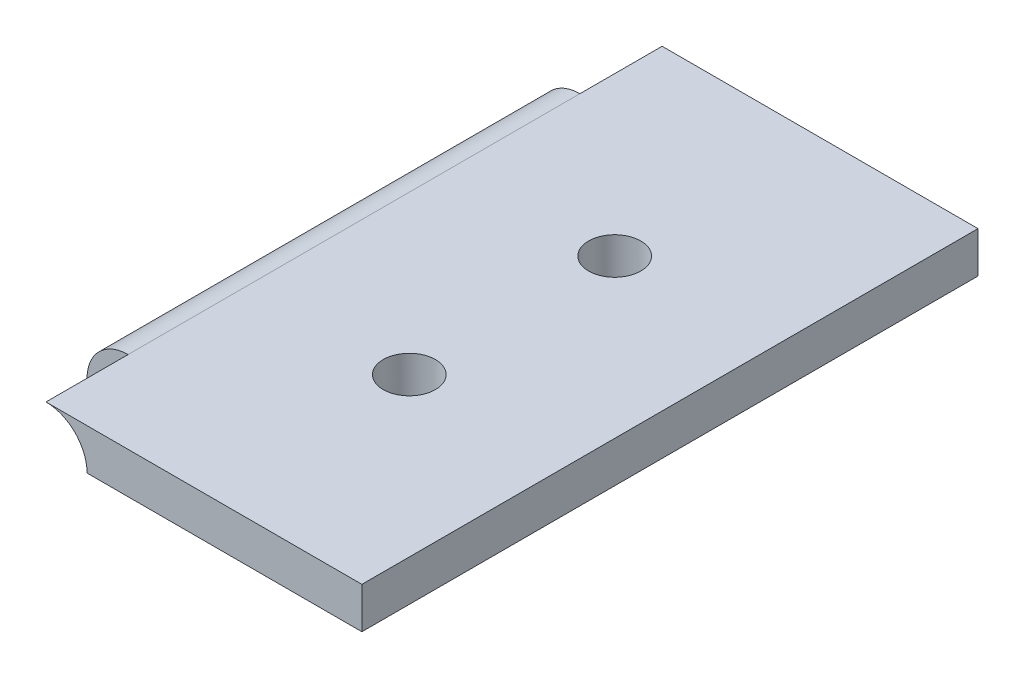
ISO-10303-21;
HEADER;
FILE_DESCRIPTION(('STEP AP214'),'2;1');
FILE_NAME('part.step','',(''),(''),'','','');
FILE_SCHEMA(('AUTOMOTIVE_DESIGN { 1 0 10303 214 1 1 1 1 }'));
ENDSEC;
DATA;
#1=APPLICATION_CONTEXT('core data for automotive mechanical design processes');
#2=APPLICATION_PROTOCOL_DEFINITION('international standard','automotive_design',2000,#1);
#3=PRODUCT_CONTEXT('',#1,'mechanical');
#4=PRODUCT('Part','Part','',(#3));
#5=PRODUCT_RELATED_PRODUCT_CATEGORY('part','',(#4));
#6=PRODUCT_DEFINITION_FORMATION('','',#4);
#7=PRODUCT_DEFINITION_CONTEXT('part definition',#1,'design');
#8=PRODUCT_DEFINITION('design','',#6,#7);
#9=PRODUCT_DEFINITION_SHAPE('','',#8);
#10=(LENGTH_UNIT() NAMED_UNIT(*) SI_UNIT(.MILLI.,.METRE.));
#11=(NAMED_UNIT(*) PLANE_ANGLE_UNIT() SI_UNIT($,.RADIAN.));
#12=(NAMED_UNIT(*) SI_UNIT($,.STERADIAN.) SOLID_ANGLE_UNIT());
#13=UNCERTAINTY_MEASURE_WITH_UNIT(LENGTH_MEASURE(1.E-05),#10,'distance_accuracy_value','');
#14=(GEOMETRIC_REPRESENTATION_CONTEXT(3) GLOBAL_UNCERTAINTY_ASSIGNED_CONTEXT((#13)) GLOBAL_UNIT_ASSIGNED_CONTEXT((#10,
#11,#12)) REPRESENTATION_CONTEXT('',''));
#15=CARTESIAN_POINT('',(0.,0.,0.));
#16=DIRECTION('',(0.,0.,1.));
#17=DIRECTION('',(1.,0.,0.));
#18=AXIS2_PLACEMENT_3D('',#15,#16,#17);
#19=CARTESIAN_POINT('',(5.77350269189673,-5.,-64.999999999999));
#20=DIRECTION('',(0.,0.,1.));
#21=DIRECTION('',(1.,0.,0.));
#22=AXIS2_PLACEMENT_3D('',#19,#20,#21);
#23=CYLINDRICAL_SURFACE('',#22,2.5);
#24=CARTESIAN_POINT('',(5.77350269189673,-5.,-64.999999999999));
#25=DIRECTION('',(0.,0.,1.));
#26=DIRECTION('',(1.,0.,0.));
#27=AXIS2_PLACEMENT_3D('',#24,#25,#26);
#28=CIRCLE('',#27,2.5);
#29=CARTESIAN_POINT('',(8.27350269189673,-5.,-64.999999999999));
#30=VERTEX_POINT('',#29);
#31=EDGE_CURVE('E118',#30,#30,#28,.T.);
#32=ORIENTED_EDGE('',*,*,#31,.F.);
#33=EDGE_LOOP('',(#32));
#34=FACE_BOUND('',#33,.T.);
#35=CARTESIAN_POINT('',(5.77350269189673,-5.,-9.999999999999));
#36=DIRECTION('',(0.,0.,1.));
#37=DIRECTION('',(1.,0.,0.));
#38=AXIS2_PLACEMENT_3D('',#35,#36,#37);
#39=CIRCLE('',#38,2.5);
#40=CARTESIAN_POINT('',(8.27350269189673,-5.,-9.999999999999));
#41=VERTEX_POINT('',#40);
#42=EDGE_CURVE('E102',#41,#41,#39,.T.);
#43=ORIENTED_EDGE('',*,*,#42,.T.);
#44=EDGE_LOOP('',(#43));
#45=FACE_BOUND('',#44,.T.);
#46=ADVANCED_FACE('F34',(#34,#45),#23,.F.);
#47=CARTESIAN_POINT('',(5.77350269189673,-5.,-75.));
#48=DIRECTION('',(0.,-1.,0.));
#49=DIRECTION('',(1.,0.,0.));
#50=AXIS2_PLACEMENT_3D('',#47,#48,#49);
#51=PLANE('',#50);
#52=DIRECTION('',(0.,0.,1.));
#53=VECTOR('',#52,1.);
#54=CARTESIAN_POINT('',(10.773502691897,-5.00000000000025,-75.));
#55=LINE('',#54,#53);
#56=CARTESIAN_POINT('',(10.773502691897,-5.00000000000025,-75.));
#57=VERTEX_POINT('',#56);
#58=CARTESIAN_POINT('',(10.7735026918968,-5.,-65.));
#59=VERTEX_POINT('',#58);
#60=EDGE_CURVE('E146',#57,#59,#55,.T.);
#61=ORIENTED_EDGE('',*,*,#60,.F.);
#62=DIRECTION('',(1.,0.,0.));
#63=VECTOR('',#62,1.);
#64=CARTESIAN_POINT('',(5.77350269189673,-5.,-75.));
#65=LINE('',#64,#63);
#66=CARTESIAN_POINT('',(44.2264973081033,-5.,-75.));
#67=VERTEX_POINT('',#66);
#68=EDGE_CURVE('E94',#57,#67,#65,.T.);
#69=ORIENTED_EDGE('',*,*,#68,.T.);
#70=DIRECTION('',(0.,0.,1.));
#71=VECTOR('',#70,1.);
#72=CARTESIAN_POINT('',(44.2264973081033,-5.,-75.));
#73=LINE('',#72,#71);
#74=CARTESIAN_POINT('',(44.2264973081033,-5.,0.));
#75=VERTEX_POINT('',#74);
#76=EDGE_CURVE('E78',#67,#75,#73,.T.);
#77=ORIENTED_EDGE('',*,*,#76,.T.);
#78=DIRECTION('',(1.,0.,0.));
#79=VECTOR('',#78,1.);
#80=CARTESIAN_POINT('',(5.77350269189673,-5.,0.));
#81=LINE('',#80,#79);
#82=CARTESIAN_POINT('',(10.773502691897,-5.00000000000025,0.));
#83=VERTEX_POINT('',#82);
#84=EDGE_CURVE('E87',#83,#75,#81,.T.);
#85=ORIENTED_EDGE('',*,*,#84,.F.);
#86=DIRECTION('',(0.,0.,1.));
#87=VECTOR('',#86,1.);
#88=CARTESIAN_POINT('',(10.773502691897,-5.00000000000025,-9.99999999999999));
#89=LINE('',#88,#87);
#90=CARTESIAN_POINT('',(10.773502691897,-5.00000000000025,-9.99999999999999));
#91=VERTEX_POINT('',#90);
#92=EDGE_CURVE('E155',#91,#83,#89,.T.);
#93=ORIENTED_EDGE('',*,*,#92,.F.);
#94=DIRECTION('',(0.,0.,1.));
#95=VECTOR('',#94,1.);
#96=CARTESIAN_POINT('',(10.773502691897,-5.00000000000021,-65.));
#97=LINE('',#96,#95);
#98=EDGE_CURVE('E127',#59,#91,#97,.T.);
#99=ORIENTED_EDGE('',*,*,#98,.F.);
#100=EDGE_LOOP('',(#61,#69,#77,#85,#93,#99));
#101=FACE_BOUND('',#100,.T.);
#102=CARTESIAN_POINT('',(25.0000000000001,-5.,-50.));
#103=DIRECTION('',(0.,-1.,0.));
#104=DIRECTION('',(1.,0.,0.));
#105=AXIS2_PLACEMENT_3D('',#102,#103,#104);
#106=CIRCLE('',#105,3.17500000000001);
#107=CARTESIAN_POINT('',(28.1750000000001,-5.,-50.));
#108=VERTEX_POINT('',#107);
#109=EDGE_CURVE('E114',#108,#108,#106,.T.);
#110=ORIENTED_EDGE('',*,*,#109,.F.);
#111=EDGE_LOOP('',(#110));
#112=FACE_BOUND('',#111,.T.);
#113=CARTESIAN_POINT('',(25.,-5.,-25.));
#114=DIRECTION('',(0.,-1.,0.));
#115=DIRECTION('',(1.,0.,0.));
#116=AXIS2_PLACEMENT_3D('',#113,#114,#115);
#117=CIRCLE('',#116,3.175);
#118=CARTESIAN_POINT('',(28.175,-5.,-25.));
#119=VERTEX_POINT('',#118);
#120=EDGE_CURVE('E103',#119,#119,#117,.T.);
#121=ORIENTED_EDGE('',*,*,#120,.F.);
#122=EDGE_LOOP('',(#121));
#123=FACE_BOUND('',#122,.T.);
#124=ADVANCED_FACE('F36',(#101,#112,#123),#51,.T.);
#125=CARTESIAN_POINT('',(44.2264973081033,0.,-75.));
#126=DIRECTION('',(0.,1.,0.));
#127=DIRECTION('',(-1.,0.,0.));
#128=AXIS2_PLACEMENT_3D('',#125,#126,#127);
#129=PLANE('',#128);
#130=CARTESIAN_POINT('',(25.0000000000001,0.,-50.));
#131=DIRECTION('',(0.,1.,0.));
#132=DIRECTION('',(-1.,0.,0.));
#133=AXIS2_PLACEMENT_3D('',#130,#131,#132);
#134=CIRCLE('',#133,3.17500000000001);
#135=CARTESIAN_POINT('',(21.8250000000001,0.,-50.));
#136=VERTEX_POINT('',#135);
#137=EDGE_CURVE('E38',#136,#136,#134,.T.);
#138=ORIENTED_EDGE('',*,*,#137,.F.);
#139=EDGE_LOOP('',(#138));
#140=FACE_BOUND('',#139,.T.);
#141=CARTESIAN_POINT('',(25.,0.,-25.));
#142=DIRECTION('',(0.,1.,0.));
#143=DIRECTION('',(-1.,0.,0.));
#144=AXIS2_PLACEMENT_3D('',#141,#142,#143);
#145=CIRCLE('',#144,3.175);
#146=CARTESIAN_POINT('',(21.825,0.,-25.));
#147=VERTEX_POINT('',#146);
#148=EDGE_CURVE('E100',#147,#147,#145,.T.);
#149=ORIENTED_EDGE('',*,*,#148,.F.);
#150=EDGE_LOOP('',(#149));
#151=FACE_BOUND('',#150,.T.);
#152=DIRECTION('',(-1.,0.,0.));
#153=VECTOR('',#152,1.);
#154=CARTESIAN_POINT('',(44.2264973081033,0.,0.));
#155=LINE('',#154,#153);
#156=CARTESIAN_POINT('',(44.2264973081033,0.,0.));
#157=VERTEX_POINT('',#156);
#158=CARTESIAN_POINT('',(5.77350269189675,0.,0.));
#159=VERTEX_POINT('',#158);
#160=EDGE_CURVE('E85',#157,#159,#155,.T.);
#161=ORIENTED_EDGE('',*,*,#160,.F.);
#162=DIRECTION('',(0.,0.,1.));
#163=VECTOR('',#162,1.);
#164=CARTESIAN_POINT('',(44.2264973081033,0.,-75.));
#165=LINE('',#164,#163);
#166=CARTESIAN_POINT('',(44.2264973081033,0.,-75.));
#167=VERTEX_POINT('',#166);
#168=EDGE_CURVE('E59',#167,#157,#165,.T.);
#169=ORIENTED_EDGE('',*,*,#168,.F.);
#170=DIRECTION('',(-1.,0.,0.));
#171=VECTOR('',#170,1.);
#172=CARTESIAN_POINT('',(44.2264973081033,0.,-75.));
#173=LINE('',#172,#171);
#174=CARTESIAN_POINT('',(5.77350269189675,0.,-75.));
#175=VERTEX_POINT('',#174);
#176=EDGE_CURVE('E99',#167,#175,#173,.T.);
#177=ORIENTED_EDGE('',*,*,#176,.T.);
#178=DIRECTION('',(0.,0.,1.));
#179=VECTOR('',#178,1.);
#180=CARTESIAN_POINT('',(5.77350269189673,0.,-75.));
#181=LINE('',#180,#179);
#182=CARTESIAN_POINT('',(5.77350269189675,0.,-65.));
#183=VERTEX_POINT('',#182);
#184=EDGE_CURVE('E11',#175,#183,#181,.T.);
#185=ORIENTED_EDGE('',*,*,#184,.T.);
#186=DIRECTION('',(0.,0.,1.));
#187=VECTOR('',#186,1.);
#188=CARTESIAN_POINT('',(5.77350269189675,0.,-65.));
#189=LINE('',#188,#187);
#190=CARTESIAN_POINT('',(5.77350269189675,0.,-9.99999999999999));
#191=VERTEX_POINT('',#190);
#192=EDGE_CURVE('E123',#183,#191,#189,.T.);
#193=ORIENTED_EDGE('',*,*,#192,.T.);
#194=EDGE_CURVE('E43',#191,#159,#181,.T.);
#195=ORIENTED_EDGE('',*,*,#194,.T.);
#196=EDGE_LOOP('',(#161,#169,#177,#185,#193,#195));
#197=FACE_BOUND('',#196,.T.);
#198=ADVANCED_FACE('F91',(#140,#151,#197),#129,.T.);
#199=CARTESIAN_POINT('',(44.2264973081033,-5.,-75.));
#200=DIRECTION('',(1.,0.,0.));
#201=DIRECTION('',(0.,0.,-1.));
#202=AXIS2_PLACEMENT_3D('',#199,#200,#201);
#203=PLANE('',#202);
#204=DIRECTION('',(0.,1.,0.));
#205=VECTOR('',#204,1.);
#206=CARTESIAN_POINT('',(44.2264973081033,-5.,0.));
#207=LINE('',#206,#205);
#208=EDGE_CURVE('E74',#75,#157,#207,.T.);
#209=ORIENTED_EDGE('',*,*,#208,.F.);
#210=ORIENTED_EDGE('',*,*,#76,.F.);
#211=DIRECTION('',(0.,1.,0.));
#212=VECTOR('',#211,1.);
#213=CARTESIAN_POINT('',(44.2264973081033,-5.,-75.));
#214=LINE('',#213,#212);
#215=EDGE_CURVE('E76',#67,#167,#214,.T.);
#216=ORIENTED_EDGE('',*,*,#215,.T.);
#217=ORIENTED_EDGE('',*,*,#168,.T.);
#218=EDGE_LOOP('',(#209,#210,#216,#217));
#219=FACE_BOUND('',#218,.T.);
#220=ADVANCED_FACE('F72',(#219),#203,.T.);
#221=CARTESIAN_POINT('',(5.77350269189673,-5.,-75.));
#222=DIRECTION('',(0.,0.,1.));
#223=DIRECTION('',(1.,0.,0.));
#224=AXIS2_PLACEMENT_3D('',#221,#222,#223);
#225=PLANE('',#224);
#226=ORIENTED_EDGE('',*,*,#68,.F.);
#227=CARTESIAN_POINT('',(5.77350269189676,-5.00000000000014,-74.9999999999988));
#228=DIRECTION('',(0.,0.,1.));
#229=DIRECTION('',(1.,0.,0.));
#230=AXIS2_PLACEMENT_3D('',#227,#228,#229);
#231=CIRCLE('',#230,5.);
#232=EDGE_CURVE('E143',#57,#175,#231,.T.);
#233=ORIENTED_EDGE('',*,*,#232,.T.);
#234=ORIENTED_EDGE('',*,*,#176,.F.);
#235=ORIENTED_EDGE('',*,*,#215,.F.);
#236=EDGE_LOOP('',(#226,#233,#234,#235));
#237=FACE_BOUND('',#236,.T.);
#238=ADVANCED_FACE('F141',(#237),#225,.F.);
#239=CARTESIAN_POINT('',(5.77350269189673,-5.,0.));
#240=DIRECTION('',(0.,0.,1.));
#241=DIRECTION('',(1.,0.,0.));
#242=AXIS2_PLACEMENT_3D('',#239,#240,#241);
#243=PLANE('',#242);
#244=CARTESIAN_POINT('',(5.77350269189676,-5.00000000000014,1.13797860024079E-12));
#245=DIRECTION('',(0.,0.,1.));
#246=DIRECTION('',(1.,0.,0.));
#247=AXIS2_PLACEMENT_3D('',#244,#245,#246);
#248=CIRCLE('',#247,5.);
#249=EDGE_CURVE('E148',#83,#159,#248,.T.);
#250=ORIENTED_EDGE('',*,*,#249,.F.);
#251=ORIENTED_EDGE('',*,*,#84,.T.);
#252=ORIENTED_EDGE('',*,*,#208,.T.);
#253=ORIENTED_EDGE('',*,*,#160,.T.);
#254=EDGE_LOOP('',(#250,#251,#252,#253));
#255=FACE_BOUND('',#254,.T.);
#256=ADVANCED_FACE('F83',(#255),#243,.T.);
#257=CARTESIAN_POINT('',(5.77350269189676,-5.00000000000014,-64.999999999999));
#258=DIRECTION('',(0.,0.,1.));
#259=DIRECTION('',(1.,0.,0.));
#260=AXIS2_PLACEMENT_3D('',#257,#258,#259);
#261=CYLINDRICAL_SURFACE('',#260,5.);
#262=CARTESIAN_POINT('',(5.77350269189676,-5.00000000000014,-9.999999999999));
#263=DIRECTION('',(0.,0.,1.));
#264=DIRECTION('',(1.,0.,0.));
#265=AXIS2_PLACEMENT_3D('',#262,#263,#264);
#266=CIRCLE('',#265,5.);
#267=EDGE_CURVE('E107',#191,#91,#266,.T.);
#268=ORIENTED_EDGE('',*,*,#267,.F.);
#269=ORIENTED_EDGE('',*,*,#192,.F.);
#270=CARTESIAN_POINT('',(5.77350269189676,-5.00000000000014,-64.999999999999));
#271=DIRECTION('',(0.,0.,1.));
#272=DIRECTION('',(1.,0.,0.));
#273=AXIS2_PLACEMENT_3D('',#270,#271,#272);
#274=CIRCLE('',#273,5.);
#275=EDGE_CURVE('E121',#183,#59,#274,.T.);
#276=ORIENTED_EDGE('',*,*,#275,.T.);
#277=ORIENTED_EDGE('',*,*,#98,.T.);
#278=EDGE_LOOP('',(#268,#269,#276,#277));
#279=FACE_BOUND('',#278,.T.);
#280=ADVANCED_FACE('F184',(#279),#261,.T.);
#281=CARTESIAN_POINT('',(58.6754727752881,-369.292878629585,-65.));
#282=DIRECTION('',(0.,0.,1.));
#283=DIRECTION('',(1.,0.,0.));
#284=AXIS2_PLACEMENT_3D('',#281,#282,#283);
#285=PLANE('',#284);
#286=ORIENTED_EDGE('',*,*,#31,.T.);
#287=EDGE_LOOP('',(#286));
#288=FACE_BOUND('',#287,.T.);
#289=ORIENTED_EDGE('',*,*,#275,.F.);
#290=CARTESIAN_POINT('',(5.77350269189676,-5.00000000000014,-64.9999999999989));
#291=DIRECTION('',(0.,0.,1.));
#292=DIRECTION('',(1.,0.,0.));
#293=AXIS2_PLACEMENT_3D('',#290,#291,#292);
#294=CIRCLE('',#293,5.);
#295=EDGE_CURVE('E50',#59,#183,#294,.T.);
#296=ORIENTED_EDGE('',*,*,#295,.F.);
#297=EDGE_LOOP('',(#289,#296));
#298=FACE_BOUND('',#297,.T.);
#299=ADVANCED_FACE('F185',(#288,#298),#285,.F.);
#300=CARTESIAN_POINT('',(58.6754727752881,-369.292878629585,-10.));
#301=DIRECTION('',(0.,0.,1.));
#302=DIRECTION('',(1.,0.,0.));
#303=AXIS2_PLACEMENT_3D('',#300,#301,#302);
#304=PLANE('',#303);
#305=ORIENTED_EDGE('',*,*,#42,.F.);
#306=EDGE_LOOP('',(#305));
#307=FACE_BOUND('',#306,.T.);
#308=CARTESIAN_POINT('',(5.77350269189676,-5.00000000000014,-9.99999999999885));
#309=DIRECTION('',(0.,0.,1.));
#310=DIRECTION('',(1.,0.,0.));
#311=AXIS2_PLACEMENT_3D('',#308,#309,#310);
#312=CIRCLE('',#311,5.);
#313=EDGE_CURVE('E152',#91,#191,#312,.T.);
#314=ORIENTED_EDGE('',*,*,#313,.T.);
#315=ORIENTED_EDGE('',*,*,#267,.T.);
#316=EDGE_LOOP('',(#314,#315));
#317=FACE_BOUND('',#316,.T.);
#318=ADVANCED_FACE('F187',(#307,#317),#304,.T.);
#319=CARTESIAN_POINT('',(25.,50.,-25.));
#320=DIRECTION('',(0.,-1.,0.));
#321=DIRECTION('',(1.,0.,0.));
#322=AXIS2_PLACEMENT_3D('',#319,#320,#321);
#323=CYLINDRICAL_SURFACE('',#322,3.175);
#324=ORIENTED_EDGE('',*,*,#148,.T.);
#325=EDGE_LOOP('',(#324));
#326=FACE_BOUND('',#325,.T.);
#327=ORIENTED_EDGE('',*,*,#120,.T.);
#328=EDGE_LOOP('',(#327));
#329=FACE_BOUND('',#328,.T.);
#330=ADVANCED_FACE('F194',(#326,#329),#323,.F.);
#331=CARTESIAN_POINT('',(25.0000000000001,50.,-50.));
#332=DIRECTION('',(0.,-1.,0.));
#333=DIRECTION('',(1.,0.,0.));
#334=AXIS2_PLACEMENT_3D('',#331,#332,#333);
#335=CYLINDRICAL_SURFACE('',#334,3.17500000000001);
#336=ORIENTED_EDGE('',*,*,#137,.T.);
#337=EDGE_LOOP('',(#336));
#338=FACE_BOUND('',#337,.T.);
#339=ORIENTED_EDGE('',*,*,#109,.T.);
#340=EDGE_LOOP('',(#339));
#341=FACE_BOUND('',#340,.T.);
#342=ADVANCED_FACE('F164',(#338,#341),#335,.F.);
#343=CARTESIAN_POINT('',(5.77350269189676,-5.00000000000014,-9.99999999999885));
#344=DIRECTION('',(0.,0.,1.));
#345=DIRECTION('',(1.,0.,0.));
#346=AXIS2_PLACEMENT_3D('',#343,#344,#345);
#347=CYLINDRICAL_SURFACE('',#346,5.);
#348=ORIENTED_EDGE('',*,*,#249,.T.);
#349=ORIENTED_EDGE('',*,*,#194,.F.);
#350=ORIENTED_EDGE('',*,*,#313,.F.);
#351=ORIENTED_EDGE('',*,*,#92,.T.);
#352=EDGE_LOOP('',(#348,#349,#350,#351));
#353=FACE_BOUND('',#352,.T.);
#354=ADVANCED_FACE('F239',(#353),#347,.F.);
#355=CARTESIAN_POINT('',(5.77350269189676,-5.00000000000014,-74.9999999999988));
#356=DIRECTION('',(0.,0.,1.));
#357=DIRECTION('',(1.,0.,0.));
#358=AXIS2_PLACEMENT_3D('',#355,#356,#357);
#359=CYLINDRICAL_SURFACE('',#358,5.);
#360=ORIENTED_EDGE('',*,*,#295,.T.);
#361=ORIENTED_EDGE('',*,*,#184,.F.);
#362=ORIENTED_EDGE('',*,*,#232,.F.);
#363=ORIENTED_EDGE('',*,*,#60,.T.);
#364=EDGE_LOOP('',(#360,#361,#362,#363));
#365=FACE_BOUND('',#364,.T.);
#366=ADVANCED_FACE('F179',(#365),#359,.F.);
#367=CLOSED_SHELL('',(#46,#124,#198,#220,#238,#256,#280,#299,#318,#330,#342,#354,#366));
#368=MANIFOLD_SOLID_BREP('B2',#367);
#369=ADVANCED_BREP_SHAPE_REPRESENTATION('',(#18,#368),#14);
#370=SHAPE_DEFINITION_REPRESENTATION(#9,#369);
ENDSEC;
END-ISO-10303-21;
